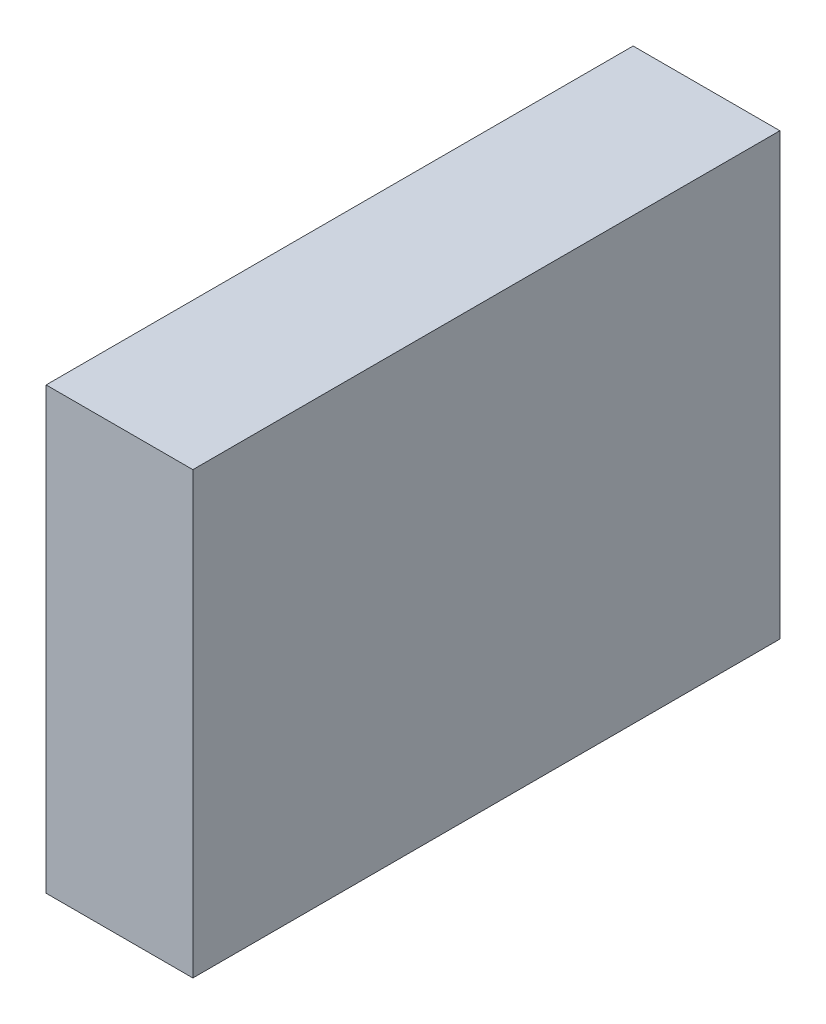
ISO-10303-21;
HEADER;
FILE_DESCRIPTION(('STEP AP214'),'2;1');
FILE_NAME('part.step','',(''),(''),'','','');
FILE_SCHEMA(('AUTOMOTIVE_DESIGN { 1 0 10303 214 1 1 1 1 }'));
ENDSEC;
DATA;
#1=APPLICATION_CONTEXT('core data for automotive mechanical design processes');
#2=APPLICATION_PROTOCOL_DEFINITION('international standard','automotive_design',2000,#1);
#3=PRODUCT_CONTEXT('',#1,'mechanical');
#4=PRODUCT('Part','Part','',(#3));
#5=PRODUCT_RELATED_PRODUCT_CATEGORY('part','',(#4));
#6=PRODUCT_DEFINITION_FORMATION('','',#4);
#7=PRODUCT_DEFINITION_CONTEXT('part definition',#1,'design');
#8=PRODUCT_DEFINITION('design','',#6,#7);
#9=PRODUCT_DEFINITION_SHAPE('','',#8);
#10=(LENGTH_UNIT() NAMED_UNIT(*) SI_UNIT(.MILLI.,.METRE.));
#11=(NAMED_UNIT(*) PLANE_ANGLE_UNIT() SI_UNIT($,.RADIAN.));
#12=(NAMED_UNIT(*) SI_UNIT($,.STERADIAN.) SOLID_ANGLE_UNIT());
#13=UNCERTAINTY_MEASURE_WITH_UNIT(LENGTH_MEASURE(1.E-05),#10,'distance_accuracy_value','');
#14=(GEOMETRIC_REPRESENTATION_CONTEXT(3) GLOBAL_UNCERTAINTY_ASSIGNED_CONTEXT((#13)) GLOBAL_UNIT_ASSIGNED_CONTEXT((#10,
#11,#12)) REPRESENTATION_CONTEXT('',''));
#15=CARTESIAN_POINT('',(0.,0.,0.));
#16=DIRECTION('',(0.,0.,1.));
#17=DIRECTION('',(1.,0.,0.));
#18=AXIS2_PLACEMENT_3D('',#15,#16,#17);
#19=CARTESIAN_POINT('',(0.,0.,101.6));
#20=DIRECTION('',(1.,0.,0.));
#21=DIRECTION('',(0.,0.,-1.));
#22=AXIS2_PLACEMENT_3D('',#19,#20,#21);
#23=PLANE('',#22);
#24=DIRECTION('',(0.,-1.,0.));
#25=VECTOR('',#24,1.);
#26=CARTESIAN_POINT('',(0.,0.,0.));
#27=LINE('',#26,#25);
#28=CARTESIAN_POINT('',(0.,76.2,0.));
#29=VERTEX_POINT('',#28);
#30=CARTESIAN_POINT('',(0.,0.,0.));
#31=VERTEX_POINT('',#30);
#32=EDGE_CURVE('E93',#29,#31,#27,.T.);
#33=ORIENTED_EDGE('',*,*,#32,.T.);
#34=DIRECTION('',(0.,0.,-1.));
#35=VECTOR('',#34,1.);
#36=CARTESIAN_POINT('',(0.,0.,101.6));
#37=LINE('',#36,#35);
#38=CARTESIAN_POINT('',(0.,0.,101.6));
#39=VERTEX_POINT('',#38);
#40=EDGE_CURVE('E11',#39,#31,#37,.T.);
#41=ORIENTED_EDGE('',*,*,#40,.F.);
#42=DIRECTION('',(0.,-1.,0.));
#43=VECTOR('',#42,1.);
#44=CARTESIAN_POINT('',(0.,0.,101.6));
#45=LINE('',#44,#43);
#46=CARTESIAN_POINT('',(0.,76.2,101.6));
#47=VERTEX_POINT('',#46);
#48=EDGE_CURVE('E81',#47,#39,#45,.T.);
#49=ORIENTED_EDGE('',*,*,#48,.F.);
#50=DIRECTION('',(0.,0.,-1.));
#51=VECTOR('',#50,1.);
#52=CARTESIAN_POINT('',(0.,76.2,101.6));
#53=LINE('',#52,#51);
#54=EDGE_CURVE('E89',#47,#29,#53,.T.);
#55=ORIENTED_EDGE('',*,*,#54,.T.);
#56=EDGE_LOOP('',(#33,#41,#49,#55));
#57=FACE_BOUND('',#56,.T.);
#58=ADVANCED_FACE('F30',(#57),#23,.F.);
#59=CARTESIAN_POINT('',(0.,0.,101.6));
#60=DIRECTION('',(0.,1.,0.));
#61=DIRECTION('',(0.,0.,1.));
#62=AXIS2_PLACEMENT_3D('',#59,#60,#61);
#63=PLANE('',#62);
#64=DIRECTION('',(1.,0.,0.));
#65=VECTOR('',#64,1.);
#66=CARTESIAN_POINT('',(0.,0.,0.));
#67=LINE('',#66,#65);
#68=CARTESIAN_POINT('',(25.4,0.,0.));
#69=VERTEX_POINT('',#68);
#70=EDGE_CURVE('E85',#31,#69,#67,.T.);
#71=ORIENTED_EDGE('',*,*,#70,.T.);
#72=DIRECTION('',(0.,0.,-1.));
#73=VECTOR('',#72,1.);
#74=CARTESIAN_POINT('',(25.4,0.,101.6));
#75=LINE('',#74,#73);
#76=CARTESIAN_POINT('',(25.4,0.,101.6));
#77=VERTEX_POINT('',#76);
#78=EDGE_CURVE('E38',#77,#69,#75,.T.);
#79=ORIENTED_EDGE('',*,*,#78,.F.);
#80=DIRECTION('',(1.,0.,0.));
#81=VECTOR('',#80,1.);
#82=CARTESIAN_POINT('',(0.,0.,101.6));
#83=LINE('',#82,#81);
#84=EDGE_CURVE('E76',#39,#77,#83,.T.);
#85=ORIENTED_EDGE('',*,*,#84,.F.);
#86=ORIENTED_EDGE('',*,*,#40,.T.);
#87=EDGE_LOOP('',(#71,#79,#85,#86));
#88=FACE_BOUND('',#87,.T.);
#89=ADVANCED_FACE('F84',(#88),#63,.F.);
#90=CARTESIAN_POINT('',(25.4,0.,101.6));
#91=DIRECTION('',(-1.,0.,0.));
#92=DIRECTION('',(0.,0.,1.));
#93=AXIS2_PLACEMENT_3D('',#90,#91,#92);
#94=PLANE('',#93);
#95=DIRECTION('',(0.,1.,0.));
#96=VECTOR('',#95,1.);
#97=CARTESIAN_POINT('',(25.4,0.,0.));
#98=LINE('',#97,#96);
#99=CARTESIAN_POINT('',(25.4,76.2,0.));
#100=VERTEX_POINT('',#99);
#101=EDGE_CURVE('E63',#69,#100,#98,.T.);
#102=ORIENTED_EDGE('',*,*,#101,.T.);
#103=DIRECTION('',(0.,0.,-1.));
#104=VECTOR('',#103,1.);
#105=CARTESIAN_POINT('',(25.4,76.2,101.6));
#106=LINE('',#105,#104);
#107=CARTESIAN_POINT('',(25.4,76.2,101.6));
#108=VERTEX_POINT('',#107);
#109=EDGE_CURVE('E86',#108,#100,#106,.T.);
#110=ORIENTED_EDGE('',*,*,#109,.F.);
#111=DIRECTION('',(0.,1.,0.));
#112=VECTOR('',#111,1.);
#113=CARTESIAN_POINT('',(25.4,0.,101.6));
#114=LINE('',#113,#112);
#115=EDGE_CURVE('E79',#77,#108,#114,.T.);
#116=ORIENTED_EDGE('',*,*,#115,.F.);
#117=ORIENTED_EDGE('',*,*,#78,.T.);
#118=EDGE_LOOP('',(#102,#110,#116,#117));
#119=FACE_BOUND('',#118,.T.);
#120=ADVANCED_FACE('F87',(#119),#94,.F.);
#121=CARTESIAN_POINT('',(0.,76.2,101.6));
#122=DIRECTION('',(0.,-1.,0.));
#123=DIRECTION('',(0.,0.,-1.));
#124=AXIS2_PLACEMENT_3D('',#121,#122,#123);
#125=PLANE('',#124);
#126=DIRECTION('',(-1.,0.,0.));
#127=VECTOR('',#126,1.);
#128=CARTESIAN_POINT('',(0.,76.2,0.));
#129=LINE('',#128,#127);
#130=EDGE_CURVE('E69',#100,#29,#129,.T.);
#131=ORIENTED_EDGE('',*,*,#130,.T.);
#132=ORIENTED_EDGE('',*,*,#54,.F.);
#133=DIRECTION('',(-1.,0.,0.));
#134=VECTOR('',#133,1.);
#135=CARTESIAN_POINT('',(0.,76.2,101.6));
#136=LINE('',#135,#134);
#137=EDGE_CURVE('E46',#108,#47,#136,.T.);
#138=ORIENTED_EDGE('',*,*,#137,.F.);
#139=ORIENTED_EDGE('',*,*,#109,.T.);
#140=EDGE_LOOP('',(#131,#132,#138,#139));
#141=FACE_BOUND('',#140,.T.);
#142=ADVANCED_FACE('F100',(#141),#125,.F.);
#143=CARTESIAN_POINT('',(0.,0.,101.6));
#144=DIRECTION('',(0.,0.,-1.));
#145=DIRECTION('',(-1.,0.,0.));
#146=AXIS2_PLACEMENT_3D('',#143,#144,#145);
#147=PLANE('',#146);
#148=ORIENTED_EDGE('',*,*,#48,.T.);
#149=ORIENTED_EDGE('',*,*,#84,.T.);
#150=ORIENTED_EDGE('',*,*,#115,.T.);
#151=ORIENTED_EDGE('',*,*,#137,.T.);
#152=EDGE_LOOP('',(#148,#149,#150,#151));
#153=FACE_BOUND('',#152,.T.);
#154=ADVANCED_FACE('F77',(#153),#147,.F.);
#155=CARTESIAN_POINT('',(0.,0.,0.));
#156=DIRECTION('',(0.,0.,-1.));
#157=DIRECTION('',(-1.,0.,0.));
#158=AXIS2_PLACEMENT_3D('',#155,#156,#157);
#159=PLANE('',#158);
#160=ORIENTED_EDGE('',*,*,#32,.F.);
#161=ORIENTED_EDGE('',*,*,#130,.F.);
#162=ORIENTED_EDGE('',*,*,#101,.F.);
#163=ORIENTED_EDGE('',*,*,#70,.F.);
#164=EDGE_LOOP('',(#160,#161,#162,#163));
#165=FACE_BOUND('',#164,.T.);
#166=ADVANCED_FACE('F103',(#165),#159,.T.);
#167=CLOSED_SHELL('',(#58,#89,#120,#142,#154,#166));
#168=MANIFOLD_SOLID_BREP('B2',#167);
#169=ADVANCED_BREP_SHAPE_REPRESENTATION('',(#18,#168),#14);
#170=SHAPE_DEFINITION_REPRESENTATION(#9,#169);
ENDSEC;
END-ISO-10303-21;
